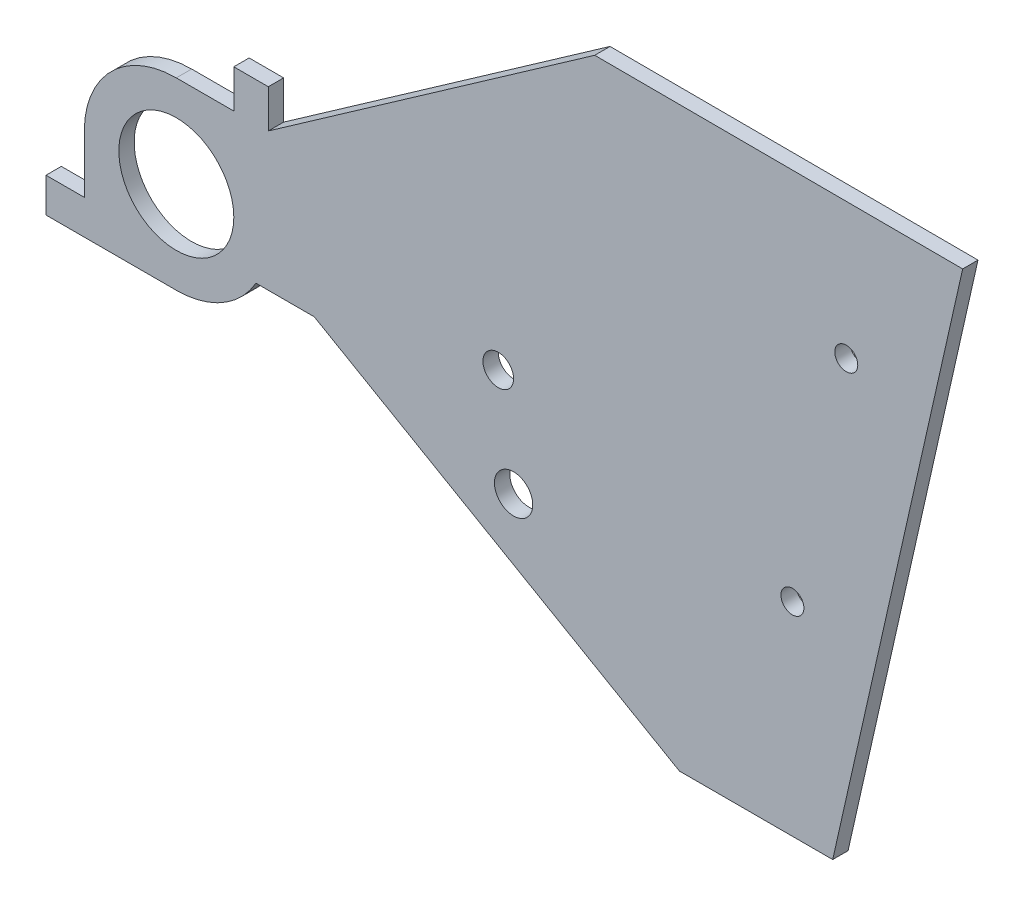
ISO-10303-21;
HEADER;
FILE_DESCRIPTION(('STEP AP214'),'2;1');
FILE_NAME('part.step','',(''),(''),'','','');
FILE_SCHEMA(('AUTOMOTIVE_DESIGN { 1 0 10303 214 1 1 1 1 }'));
ENDSEC;
DATA;
#1=APPLICATION_CONTEXT('core data for automotive mechanical design processes');
#2=APPLICATION_PROTOCOL_DEFINITION('international standard','automotive_design',2000,#1);
#3=PRODUCT_CONTEXT('',#1,'mechanical');
#4=PRODUCT('Part','Part','',(#3));
#5=PRODUCT_RELATED_PRODUCT_CATEGORY('part','',(#4));
#6=PRODUCT_DEFINITION_FORMATION('','',#4);
#7=PRODUCT_DEFINITION_CONTEXT('part definition',#1,'design');
#8=PRODUCT_DEFINITION('design','',#6,#7);
#9=PRODUCT_DEFINITION_SHAPE('','',#8);
#10=(LENGTH_UNIT() NAMED_UNIT(*) SI_UNIT(.MILLI.,.METRE.));
#11=(NAMED_UNIT(*) PLANE_ANGLE_UNIT() SI_UNIT($,.RADIAN.));
#12=(NAMED_UNIT(*) SI_UNIT($,.STERADIAN.) SOLID_ANGLE_UNIT());
#13=UNCERTAINTY_MEASURE_WITH_UNIT(LENGTH_MEASURE(1.E-05),#10,'distance_accuracy_value','');
#14=(GEOMETRIC_REPRESENTATION_CONTEXT(3) GLOBAL_UNCERTAINTY_ASSIGNED_CONTEXT((#13)) GLOBAL_UNIT_ASSIGNED_CONTEXT((#10,
#11,#12)) REPRESENTATION_CONTEXT('',''));
#15=CARTESIAN_POINT('',(0.,0.,0.));
#16=DIRECTION('',(0.,0.,1.));
#17=DIRECTION('',(1.,0.,0.));
#18=AXIS2_PLACEMENT_3D('',#15,#16,#17);
#19=CARTESIAN_POINT('',(15.,-15.,27.));
#20=DIRECTION('',(0.,0.,1.));
#21=DIRECTION('',(1.,0.,0.));
#22=AXIS2_PLACEMENT_3D('',#19,#20,#21);
#23=PLANE('',#22);
#24=CARTESIAN_POINT('',(59.,-28.,27.));
#25=DIRECTION('',(0.,0.,1.));
#26=DIRECTION('',(1.,0.,0.));
#27=AXIS2_PLACEMENT_3D('',#24,#25,#26);
#28=CIRCLE('',#27,2.49999999999999);
#29=CARTESIAN_POINT('',(61.5,-28.,27.));
#30=VERTEX_POINT('',#29);
#31=EDGE_CURVE('E349',#30,#30,#28,.T.);
#32=ORIENTED_EDGE('',*,*,#31,.F.);
#33=EDGE_LOOP('',(#32));
#34=FACE_BOUND('',#33,.T.);
#35=CARTESIAN_POINT('',(95.3735465566074,-21.9836605666019,27.));
#36=DIRECTION('',(0.,0.,1.));
#37=DIRECTION('',(1.,0.,0.));
#38=AXIS2_PLACEMENT_3D('',#35,#36,#37);
#39=CIRCLE('',#38,1.5);
#40=CARTESIAN_POINT('',(96.8735465566074,-21.9836605666019,27.));
#41=VERTEX_POINT('',#40);
#42=EDGE_CURVE('E361',#41,#41,#39,.T.);
#43=ORIENTED_EDGE('',*,*,#42,.F.);
#44=EDGE_LOOP('',(#43));
#45=FACE_BOUND('',#44,.T.);
#46=DIRECTION('',(-1.,0.,0.));
#47=VECTOR('',#46,1.);
#48=CARTESIAN_POINT('',(27.,2.,27.));
#49=LINE('',#48,#47);
#50=CARTESIAN_POINT('',(27.,2.,27.));
#51=VERTEX_POINT('',#50);
#52=CARTESIAN_POINT('',(22.5,2.,27.));
#53=VERTEX_POINT('',#52);
#54=EDGE_CURVE('E211',#51,#53,#49,.T.);
#55=ORIENTED_EDGE('',*,*,#54,.T.);
#56=DIRECTION('',(0.,-1.,0.));
#57=VECTOR('',#56,1.);
#58=CARTESIAN_POINT('',(22.5,2.,27.));
#59=LINE('',#58,#57);
#60=CARTESIAN_POINT('',(22.5,-3.,27.));
#61=VERTEX_POINT('',#60);
#62=EDGE_CURVE('E119',#53,#61,#59,.T.);
#63=ORIENTED_EDGE('',*,*,#62,.T.);
#64=DIRECTION('',(-1.,0.,0.));
#65=VECTOR('',#64,1.);
#66=CARTESIAN_POINT('',(22.5,-3.,27.));
#67=LINE('',#66,#65);
#68=CARTESIAN_POINT('',(15.,-3.,27.));
#69=VERTEX_POINT('',#68);
#70=EDGE_CURVE('E250',#61,#69,#67,.T.);
#71=ORIENTED_EDGE('',*,*,#70,.T.);
#72=CARTESIAN_POINT('',(15.,-15.,27.));
#73=DIRECTION('',(0.,0.,1.));
#74=DIRECTION('',(1.,0.,0.));
#75=AXIS2_PLACEMENT_3D('',#72,#73,#74);
#76=CIRCLE('',#75,12.);
#77=CARTESIAN_POINT('',(3.,-15.,27.));
#78=VERTEX_POINT('',#77);
#79=EDGE_CURVE('E269',#69,#78,#76,.T.);
#80=ORIENTED_EDGE('',*,*,#79,.T.);
#81=DIRECTION('',(0.,-1.,0.));
#82=VECTOR('',#81,1.);
#83=CARTESIAN_POINT('',(3.,-22.5,27.));
#84=LINE('',#83,#82);
#85=CARTESIAN_POINT('',(3.,-22.5,27.));
#86=VERTEX_POINT('',#85);
#87=EDGE_CURVE('E266',#78,#86,#84,.T.);
#88=ORIENTED_EDGE('',*,*,#87,.T.);
#89=DIRECTION('',(-1.,0.,0.));
#90=VECTOR('',#89,1.);
#91=CARTESIAN_POINT('',(-2.,-22.5,27.));
#92=LINE('',#91,#90);
#93=CARTESIAN_POINT('',(-2.,-22.5,27.));
#94=VERTEX_POINT('',#93);
#95=EDGE_CURVE('E268',#86,#94,#92,.T.);
#96=ORIENTED_EDGE('',*,*,#95,.T.);
#97=DIRECTION('',(0.,-1.,0.));
#98=VECTOR('',#97,1.);
#99=CARTESIAN_POINT('',(-1.99999999999999,-27.,27.));
#100=LINE('',#99,#98);
#101=CARTESIAN_POINT('',(-1.99999999999999,-27.,27.));
#102=VERTEX_POINT('',#101);
#103=EDGE_CURVE('E271',#94,#102,#100,.T.);
#104=ORIENTED_EDGE('',*,*,#103,.T.);
#105=DIRECTION('',(1.,0.,0.));
#106=VECTOR('',#105,1.);
#107=CARTESIAN_POINT('',(-1.99999999999999,-27.,27.));
#108=LINE('',#107,#106);
#109=CARTESIAN_POINT('',(15.,-27.,27.));
#110=VERTEX_POINT('',#109);
#111=EDGE_CURVE('E277',#102,#110,#108,.T.);
#112=ORIENTED_EDGE('',*,*,#111,.T.);
#113=CARTESIAN_POINT('',(15.,-15.,27.));
#114=DIRECTION('',(0.,0.,1.));
#115=DIRECTION('',(-1.,0.,0.));
#116=AXIS2_PLACEMENT_3D('',#113,#114,#115);
#117=CIRCLE('',#116,12.);
#118=CARTESIAN_POINT('',(25.3923048454133,-21.,27.));
#119=VERTEX_POINT('',#118);
#120=EDGE_CURVE('E279',#110,#119,#117,.T.);
#121=ORIENTED_EDGE('',*,*,#120,.T.);
#122=DIRECTION('',(1.,0.,0.));
#123=VECTOR('',#122,1.);
#124=CARTESIAN_POINT('',(25.3923048454133,-21.,27.));
#125=LINE('',#124,#123);
#126=CARTESIAN_POINT('',(33.,-21.,27.));
#127=VERTEX_POINT('',#126);
#128=EDGE_CURVE('E281',#119,#127,#125,.T.);
#129=ORIENTED_EDGE('',*,*,#128,.T.);
#130=DIRECTION('',(0.866025403784441,-0.499999999999996,0.));
#131=VECTOR('',#130,1.);
#132=CARTESIAN_POINT('',(33.,-21.,27.));
#133=LINE('',#132,#131);
#134=CARTESIAN_POINT('',(80.6313972081443,-48.4999999999998,27.));
#135=VERTEX_POINT('',#134);
#136=EDGE_CURVE('E283',#127,#135,#133,.T.);
#137=ORIENTED_EDGE('',*,*,#136,.T.);
#138=DIRECTION('',(1.,0.,0.));
#139=VECTOR('',#138,1.);
#140=CARTESIAN_POINT('',(80.6313972081443,-48.4999999999998,27.));
#141=LINE('',#140,#139);
#142=CARTESIAN_POINT('',(100.631397208144,-48.4999999999998,27.));
#143=VERTEX_POINT('',#142);
#144=EDGE_CURVE('E285',#135,#143,#141,.T.);
#145=ORIENTED_EDGE('',*,*,#144,.T.);
#146=DIRECTION('',(0.219896280158805,0.975523257525068,0.));
#147=VECTOR('',#146,1.);
#148=CARTESIAN_POINT('',(117.584077601536,26.7069748028441,27.));
#149=LINE('',#148,#147);
#150=CARTESIAN_POINT('',(117.584077601536,26.7069748028441,27.));
#151=VERTEX_POINT('',#150);
#152=EDGE_CURVE('E162',#143,#151,#149,.T.);
#153=ORIENTED_EDGE('',*,*,#152,.T.);
#154=DIRECTION('',(-0.999995992867543,0.00283094487004673,0.));
#155=VECTOR('',#154,1.);
#156=CARTESIAN_POINT('',(69.5840776015355,26.8428607011191,27.));
#157=LINE('',#156,#155);
#158=CARTESIAN_POINT('',(69.5840776015355,26.8428607011191,27.));
#159=VERTEX_POINT('',#158);
#160=EDGE_CURVE('E156',#151,#159,#157,.T.);
#161=ORIENTED_EDGE('',*,*,#160,.T.);
#162=DIRECTION('',(-0.818924569260298,-0.573901167329214,0.));
#163=VECTOR('',#162,1.);
#164=CARTESIAN_POINT('',(27.,-3.,27.));
#165=LINE('',#164,#163);
#166=CARTESIAN_POINT('',(27.,-3.,27.));
#167=VERTEX_POINT('',#166);
#168=EDGE_CURVE('E160',#159,#167,#165,.T.);
#169=ORIENTED_EDGE('',*,*,#168,.T.);
#170=DIRECTION('',(0.,1.,0.));
#171=VECTOR('',#170,1.);
#172=CARTESIAN_POINT('',(27.,-3.,27.));
#173=LINE('',#172,#171);
#174=EDGE_CURVE('E52',#167,#51,#173,.T.);
#175=ORIENTED_EDGE('',*,*,#174,.T.);
#176=EDGE_LOOP('',(#55,#63,#71,#80,#88,#96,#104,#112,#121,#129,#137,#145,#153,#161,#169,#175));
#177=FACE_BOUND('',#176,.T.);
#178=CARTESIAN_POINT('',(102.398666770346,8.99989290911363,27.));
#179=DIRECTION('',(0.,0.,1.));
#180=DIRECTION('',(1.,0.,0.));
#181=AXIS2_PLACEMENT_3D('',#178,#179,#180);
#182=CIRCLE('',#181,1.49999999999994);
#183=CARTESIAN_POINT('',(103.898666770346,8.99989290911363,27.));
#184=VERTEX_POINT('',#183);
#185=EDGE_CURVE('E184',#184,#184,#182,.T.);
#186=ORIENTED_EDGE('',*,*,#185,.F.);
#187=EDGE_LOOP('',(#186));
#188=FACE_BOUND('',#187,.T.);
#189=CARTESIAN_POINT('',(57.,-15.,27.));
#190=DIRECTION('',(0.,0.,1.));
#191=DIRECTION('',(1.,0.,0.));
#192=AXIS2_PLACEMENT_3D('',#189,#190,#191);
#193=CIRCLE('',#192,2.);
#194=CARTESIAN_POINT('',(59.,-15.,27.));
#195=VERTEX_POINT('',#194);
#196=EDGE_CURVE('E355',#195,#195,#193,.T.);
#197=ORIENTED_EDGE('',*,*,#196,.F.);
#198=EDGE_LOOP('',(#197));
#199=FACE_BOUND('',#198,.T.);
#200=CARTESIAN_POINT('',(15.,-15.,27.));
#201=DIRECTION('',(0.,0.,1.));
#202=DIRECTION('',(1.,0.,0.));
#203=AXIS2_PLACEMENT_3D('',#200,#201,#202);
#204=CIRCLE('',#203,7.5);
#205=CARTESIAN_POINT('',(22.5,-15.,27.));
#206=VERTEX_POINT('',#205);
#207=EDGE_CURVE('E340',#206,#206,#204,.T.);
#208=ORIENTED_EDGE('',*,*,#207,.F.);
#209=EDGE_LOOP('',(#208));
#210=FACE_BOUND('',#209,.T.);
#211=ADVANCED_FACE('F35',(#34,#45,#177,#188,#199,#210),#23,.T.);
#212=CARTESIAN_POINT('',(15.,-15.,25.));
#213=DIRECTION('',(0.,0.,1.));
#214=DIRECTION('',(1.,0.,0.));
#215=AXIS2_PLACEMENT_3D('',#212,#213,#214);
#216=PLANE('',#215);
#217=DIRECTION('',(-1.,0.,0.));
#218=VECTOR('',#217,1.);
#219=CARTESIAN_POINT('',(27.,2.,25.));
#220=LINE('',#219,#218);
#221=CARTESIAN_POINT('',(27.,2.,25.));
#222=VERTEX_POINT('',#221);
#223=CARTESIAN_POINT('',(22.5,2.,25.));
#224=VERTEX_POINT('',#223);
#225=EDGE_CURVE('E180',#222,#224,#220,.T.);
#226=ORIENTED_EDGE('',*,*,#225,.F.);
#227=DIRECTION('',(0.,1.,0.));
#228=VECTOR('',#227,1.);
#229=CARTESIAN_POINT('',(27.,-3.,25.));
#230=LINE('',#229,#228);
#231=CARTESIAN_POINT('',(27.,-3.,25.));
#232=VERTEX_POINT('',#231);
#233=EDGE_CURVE('E111',#232,#222,#230,.T.);
#234=ORIENTED_EDGE('',*,*,#233,.F.);
#235=DIRECTION('',(-0.818924569260298,-0.573901167329214,0.));
#236=VECTOR('',#235,1.);
#237=CARTESIAN_POINT('',(27.,-3.,25.));
#238=LINE('',#237,#236);
#239=CARTESIAN_POINT('',(69.5840776015355,26.8428607011191,25.));
#240=VERTEX_POINT('',#239);
#241=EDGE_CURVE('E105',#240,#232,#238,.T.);
#242=ORIENTED_EDGE('',*,*,#241,.F.);
#243=DIRECTION('',(-0.999995992867543,0.00283094487004673,0.));
#244=VECTOR('',#243,1.);
#245=CARTESIAN_POINT('',(69.5840776015355,26.8428607011191,25.));
#246=LINE('',#245,#244);
#247=CARTESIAN_POINT('',(117.584077601536,26.7069748028441,25.));
#248=VERTEX_POINT('',#247);
#249=EDGE_CURVE('E170',#248,#240,#246,.T.);
#250=ORIENTED_EDGE('',*,*,#249,.F.);
#251=DIRECTION('',(0.219896280158805,0.975523257525068,0.));
#252=VECTOR('',#251,1.);
#253=CARTESIAN_POINT('',(117.584077601536,26.7069748028441,25.));
#254=LINE('',#253,#252);
#255=CARTESIAN_POINT('',(100.631397208144,-48.4999999999998,25.));
#256=VERTEX_POINT('',#255);
#257=EDGE_CURVE('E206',#256,#248,#254,.T.);
#258=ORIENTED_EDGE('',*,*,#257,.F.);
#259=DIRECTION('',(1.,0.,0.));
#260=VECTOR('',#259,1.);
#261=CARTESIAN_POINT('',(80.6313972081443,-48.4999999999998,25.));
#262=LINE('',#261,#260);
#263=CARTESIAN_POINT('',(80.6313972081443,-48.4999999999998,25.));
#264=VERTEX_POINT('',#263);
#265=EDGE_CURVE('E204',#264,#256,#262,.T.);
#266=ORIENTED_EDGE('',*,*,#265,.F.);
#267=DIRECTION('',(0.866025403784441,-0.499999999999996,0.));
#268=VECTOR('',#267,1.);
#269=CARTESIAN_POINT('',(33.,-21.,25.));
#270=LINE('',#269,#268);
#271=CARTESIAN_POINT('',(33.,-21.,25.));
#272=VERTEX_POINT('',#271);
#273=EDGE_CURVE('E202',#272,#264,#270,.T.);
#274=ORIENTED_EDGE('',*,*,#273,.F.);
#275=DIRECTION('',(1.,0.,0.));
#276=VECTOR('',#275,1.);
#277=CARTESIAN_POINT('',(25.3923048454133,-21.,25.));
#278=LINE('',#277,#276);
#279=CARTESIAN_POINT('',(25.3923048454133,-21.,25.));
#280=VERTEX_POINT('',#279);
#281=EDGE_CURVE('E200',#280,#272,#278,.T.);
#282=ORIENTED_EDGE('',*,*,#281,.F.);
#283=CARTESIAN_POINT('',(15.,-15.,25.));
#284=DIRECTION('',(0.,0.,1.));
#285=DIRECTION('',(-1.,0.,0.));
#286=AXIS2_PLACEMENT_3D('',#283,#284,#285);
#287=CIRCLE('',#286,12.);
#288=CARTESIAN_POINT('',(15.,-27.,25.));
#289=VERTEX_POINT('',#288);
#290=EDGE_CURVE('E198',#289,#280,#287,.T.);
#291=ORIENTED_EDGE('',*,*,#290,.F.);
#292=DIRECTION('',(1.,0.,0.));
#293=VECTOR('',#292,1.);
#294=CARTESIAN_POINT('',(-1.99999999999999,-27.,25.));
#295=LINE('',#294,#293);
#296=CARTESIAN_POINT('',(-1.99999999999999,-27.,25.));
#297=VERTEX_POINT('',#296);
#298=EDGE_CURVE('E196',#297,#289,#295,.T.);
#299=ORIENTED_EDGE('',*,*,#298,.F.);
#300=DIRECTION('',(0.,-1.,0.));
#301=VECTOR('',#300,1.);
#302=CARTESIAN_POINT('',(-1.99999999999999,-27.,25.));
#303=LINE('',#302,#301);
#304=CARTESIAN_POINT('',(-2.,-22.5,25.));
#305=VERTEX_POINT('',#304);
#306=EDGE_CURVE('E194',#305,#297,#303,.T.);
#307=ORIENTED_EDGE('',*,*,#306,.F.);
#308=DIRECTION('',(-1.,0.,0.));
#309=VECTOR('',#308,1.);
#310=CARTESIAN_POINT('',(-2.,-22.5,25.));
#311=LINE('',#310,#309);
#312=CARTESIAN_POINT('',(3.,-22.5,25.));
#313=VERTEX_POINT('',#312);
#314=EDGE_CURVE('E192',#313,#305,#311,.T.);
#315=ORIENTED_EDGE('',*,*,#314,.F.);
#316=DIRECTION('',(0.,-1.,0.));
#317=VECTOR('',#316,1.);
#318=CARTESIAN_POINT('',(3.,-22.5,25.));
#319=LINE('',#318,#317);
#320=CARTESIAN_POINT('',(3.,-15.,25.));
#321=VERTEX_POINT('',#320);
#322=EDGE_CURVE('E190',#321,#313,#319,.T.);
#323=ORIENTED_EDGE('',*,*,#322,.F.);
#324=CARTESIAN_POINT('',(15.,-15.,25.));
#325=DIRECTION('',(0.,0.,1.));
#326=DIRECTION('',(1.,0.,0.));
#327=AXIS2_PLACEMENT_3D('',#324,#325,#326);
#328=CIRCLE('',#327,12.);
#329=CARTESIAN_POINT('',(15.,-3.,25.));
#330=VERTEX_POINT('',#329);
#331=EDGE_CURVE('E188',#330,#321,#328,.T.);
#332=ORIENTED_EDGE('',*,*,#331,.F.);
#333=DIRECTION('',(-1.,0.,0.));
#334=VECTOR('',#333,1.);
#335=CARTESIAN_POINT('',(22.5,-3.,25.));
#336=LINE('',#335,#334);
#337=CARTESIAN_POINT('',(22.5,-3.,25.));
#338=VERTEX_POINT('',#337);
#339=EDGE_CURVE('E186',#338,#330,#336,.T.);
#340=ORIENTED_EDGE('',*,*,#339,.F.);
#341=DIRECTION('',(0.,-1.,0.));
#342=VECTOR('',#341,1.);
#343=CARTESIAN_POINT('',(22.5,2.,25.));
#344=LINE('',#343,#342);
#345=EDGE_CURVE('E183',#224,#338,#344,.T.);
#346=ORIENTED_EDGE('',*,*,#345,.F.);
#347=EDGE_LOOP('',(#226,#234,#242,#250,#258,#266,#274,#282,#291,#299,#307,#315,#323,#332,#340,#346));
#348=FACE_BOUND('',#347,.T.);
#349=CARTESIAN_POINT('',(102.398666770346,8.99989290911363,25.));
#350=DIRECTION('',(0.,0.,1.));
#351=DIRECTION('',(1.,0.,0.));
#352=AXIS2_PLACEMENT_3D('',#349,#350,#351);
#353=CIRCLE('',#352,1.49999999999994);
#354=CARTESIAN_POINT('',(103.898666770346,8.99989290911363,25.));
#355=VERTEX_POINT('',#354);
#356=EDGE_CURVE('E364',#355,#355,#353,.T.);
#357=ORIENTED_EDGE('',*,*,#356,.T.);
#358=EDGE_LOOP('',(#357));
#359=FACE_BOUND('',#358,.T.);
#360=CARTESIAN_POINT('',(95.3735465566074,-21.9836605666019,25.));
#361=DIRECTION('',(0.,0.,1.));
#362=DIRECTION('',(1.,0.,0.));
#363=AXIS2_PLACEMENT_3D('',#360,#361,#362);
#364=CIRCLE('',#363,1.5);
#365=CARTESIAN_POINT('',(96.8735465566074,-21.9836605666019,25.));
#366=VERTEX_POINT('',#365);
#367=EDGE_CURVE('E358',#366,#366,#364,.T.);
#368=ORIENTED_EDGE('',*,*,#367,.T.);
#369=EDGE_LOOP('',(#368));
#370=FACE_BOUND('',#369,.T.);
#371=CARTESIAN_POINT('',(57.,-15.,25.));
#372=DIRECTION('',(0.,0.,1.));
#373=DIRECTION('',(1.,0.,0.));
#374=AXIS2_PLACEMENT_3D('',#371,#372,#373);
#375=CIRCLE('',#374,2.);
#376=CARTESIAN_POINT('',(59.,-15.,25.));
#377=VERTEX_POINT('',#376);
#378=EDGE_CURVE('E352',#377,#377,#375,.T.);
#379=ORIENTED_EDGE('',*,*,#378,.T.);
#380=EDGE_LOOP('',(#379));
#381=FACE_BOUND('',#380,.T.);
#382=CARTESIAN_POINT('',(59.,-28.,25.));
#383=DIRECTION('',(0.,0.,1.));
#384=DIRECTION('',(1.,0.,0.));
#385=AXIS2_PLACEMENT_3D('',#382,#383,#384);
#386=CIRCLE('',#385,2.49999999999999);
#387=CARTESIAN_POINT('',(61.5,-28.,25.));
#388=VERTEX_POINT('',#387);
#389=EDGE_CURVE('E346',#388,#388,#386,.T.);
#390=ORIENTED_EDGE('',*,*,#389,.T.);
#391=EDGE_LOOP('',(#390));
#392=FACE_BOUND('',#391,.T.);
#393=CARTESIAN_POINT('',(15.,-15.,25.));
#394=DIRECTION('',(0.,0.,1.));
#395=DIRECTION('',(1.,0.,0.));
#396=AXIS2_PLACEMENT_3D('',#393,#394,#395);
#397=CIRCLE('',#396,7.5);
#398=CARTESIAN_POINT('',(22.5,-15.,25.));
#399=VERTEX_POINT('',#398);
#400=EDGE_CURVE('E343',#399,#399,#397,.T.);
#401=ORIENTED_EDGE('',*,*,#400,.T.);
#402=EDGE_LOOP('',(#401));
#403=FACE_BOUND('',#402,.T.);
#404=ADVANCED_FACE('F254',(#348,#359,#370,#381,#392,#403),#216,.F.);
#405=CARTESIAN_POINT('',(27.,2.,27.));
#406=DIRECTION('',(0.,-1.,0.));
#407=DIRECTION('',(1.,0.,0.));
#408=AXIS2_PLACEMENT_3D('',#405,#406,#407);
#409=PLANE('',#408);
#410=ORIENTED_EDGE('',*,*,#225,.T.);
#411=DIRECTION('',(0.,0.,-1.));
#412=VECTOR('',#411,1.);
#413=CARTESIAN_POINT('',(22.5,2.,27.));
#414=LINE('',#413,#412);
#415=EDGE_CURVE('E11',#53,#224,#414,.T.);
#416=ORIENTED_EDGE('',*,*,#415,.F.);
#417=ORIENTED_EDGE('',*,*,#54,.F.);
#418=DIRECTION('',(0.,0.,-1.));
#419=VECTOR('',#418,1.);
#420=CARTESIAN_POINT('',(27.,2.,27.));
#421=LINE('',#420,#419);
#422=EDGE_CURVE('E176',#51,#222,#421,.T.);
#423=ORIENTED_EDGE('',*,*,#422,.T.);
#424=EDGE_LOOP('',(#410,#416,#417,#423));
#425=FACE_BOUND('',#424,.T.);
#426=ADVANCED_FACE('F37',(#425),#409,.F.);
#427=CARTESIAN_POINT('',(22.5,2.,27.));
#428=DIRECTION('',(1.,0.,0.));
#429=DIRECTION('',(0.,1.,0.));
#430=AXIS2_PLACEMENT_3D('',#427,#428,#429);
#431=PLANE('',#430);
#432=ORIENTED_EDGE('',*,*,#345,.T.);
#433=DIRECTION('',(0.,0.,-1.));
#434=VECTOR('',#433,1.);
#435=CARTESIAN_POINT('',(22.5,-3.,27.));
#436=LINE('',#435,#434);
#437=EDGE_CURVE('E44',#61,#338,#436,.T.);
#438=ORIENTED_EDGE('',*,*,#437,.F.);
#439=ORIENTED_EDGE('',*,*,#62,.F.);
#440=ORIENTED_EDGE('',*,*,#415,.T.);
#441=EDGE_LOOP('',(#432,#438,#439,#440));
#442=FACE_BOUND('',#441,.T.);
#443=ADVANCED_FACE('F523',(#442),#431,.F.);
#444=CARTESIAN_POINT('',(22.5,-3.,27.));
#445=DIRECTION('',(0.,-1.,0.));
#446=DIRECTION('',(1.,0.,0.));
#447=AXIS2_PLACEMENT_3D('',#444,#445,#446);
#448=PLANE('',#447);
#449=ORIENTED_EDGE('',*,*,#339,.T.);
#450=DIRECTION('',(0.,0.,-1.));
#451=VECTOR('',#450,1.);
#452=CARTESIAN_POINT('',(15.,-3.,27.));
#453=LINE('',#452,#451);
#454=EDGE_CURVE('E242',#69,#330,#453,.T.);
#455=ORIENTED_EDGE('',*,*,#454,.F.);
#456=ORIENTED_EDGE('',*,*,#70,.F.);
#457=ORIENTED_EDGE('',*,*,#437,.T.);
#458=EDGE_LOOP('',(#449,#455,#456,#457));
#459=FACE_BOUND('',#458,.T.);
#460=ADVANCED_FACE('F248',(#459),#448,.F.);
#461=CARTESIAN_POINT('',(15.,-15.,27.));
#462=DIRECTION('',(0.,0.,-1.));
#463=DIRECTION('',(-1.,0.,0.));
#464=AXIS2_PLACEMENT_3D('',#461,#462,#463);
#465=CYLINDRICAL_SURFACE('',#464,12.);
#466=ORIENTED_EDGE('',*,*,#331,.T.);
#467=DIRECTION('',(0.,0.,-1.));
#468=VECTOR('',#467,1.);
#469=CARTESIAN_POINT('',(3.,-15.,27.));
#470=LINE('',#469,#468);
#471=EDGE_CURVE('E239',#78,#321,#470,.T.);
#472=ORIENTED_EDGE('',*,*,#471,.F.);
#473=ORIENTED_EDGE('',*,*,#79,.F.);
#474=ORIENTED_EDGE('',*,*,#454,.T.);
#475=EDGE_LOOP('',(#466,#472,#473,#474));
#476=FACE_BOUND('',#475,.T.);
#477=ADVANCED_FACE('F260',(#476),#465,.T.);
#478=CARTESIAN_POINT('',(3.,-22.5,27.));
#479=DIRECTION('',(1.,0.,0.));
#480=DIRECTION('',(0.,1.,0.));
#481=AXIS2_PLACEMENT_3D('',#478,#479,#480);
#482=PLANE('',#481);
#483=ORIENTED_EDGE('',*,*,#322,.T.);
#484=DIRECTION('',(0.,0.,-1.));
#485=VECTOR('',#484,1.);
#486=CARTESIAN_POINT('',(3.,-22.5,27.));
#487=LINE('',#486,#485);
#488=EDGE_CURVE('E236',#86,#313,#487,.T.);
#489=ORIENTED_EDGE('',*,*,#488,.F.);
#490=ORIENTED_EDGE('',*,*,#87,.F.);
#491=ORIENTED_EDGE('',*,*,#471,.T.);
#492=EDGE_LOOP('',(#483,#489,#490,#491));
#493=FACE_BOUND('',#492,.T.);
#494=ADVANCED_FACE('F264',(#493),#482,.F.);
#495=CARTESIAN_POINT('',(-2.,-22.5,27.));
#496=DIRECTION('',(0.,-1.,0.));
#497=DIRECTION('',(0.,0.,-1.));
#498=AXIS2_PLACEMENT_3D('',#495,#496,#497);
#499=PLANE('',#498);
#500=ORIENTED_EDGE('',*,*,#314,.T.);
#501=DIRECTION('',(0.,0.,-1.));
#502=VECTOR('',#501,1.);
#503=CARTESIAN_POINT('',(-2.,-22.5,27.));
#504=LINE('',#503,#502);
#505=EDGE_CURVE('E233',#94,#305,#504,.T.);
#506=ORIENTED_EDGE('',*,*,#505,.F.);
#507=ORIENTED_EDGE('',*,*,#95,.F.);
#508=ORIENTED_EDGE('',*,*,#488,.T.);
#509=EDGE_LOOP('',(#500,#506,#507,#508));
#510=FACE_BOUND('',#509,.T.);
#511=ADVANCED_FACE('F488',(#510),#499,.F.);
#512=CARTESIAN_POINT('',(-1.99999999999999,-27.,27.));
#513=DIRECTION('',(1.,0.,0.));
#514=DIRECTION('',(0.,1.,0.));
#515=AXIS2_PLACEMENT_3D('',#512,#513,#514);
#516=PLANE('',#515);
#517=ORIENTED_EDGE('',*,*,#306,.T.);
#518=DIRECTION('',(0.,0.,-1.));
#519=VECTOR('',#518,1.);
#520=CARTESIAN_POINT('',(-1.99999999999999,-27.,27.));
#521=LINE('',#520,#519);
#522=EDGE_CURVE('E230',#102,#297,#521,.T.);
#523=ORIENTED_EDGE('',*,*,#522,.F.);
#524=ORIENTED_EDGE('',*,*,#103,.F.);
#525=ORIENTED_EDGE('',*,*,#505,.T.);
#526=EDGE_LOOP('',(#517,#523,#524,#525));
#527=FACE_BOUND('',#526,.T.);
#528=ADVANCED_FACE('F478',(#527),#516,.F.);
#529=CARTESIAN_POINT('',(-1.99999999999999,-27.,27.));
#530=DIRECTION('',(0.,1.,0.));
#531=DIRECTION('',(-1.,0.,0.));
#532=AXIS2_PLACEMENT_3D('',#529,#530,#531);
#533=PLANE('',#532);
#534=ORIENTED_EDGE('',*,*,#298,.T.);
#535=DIRECTION('',(0.,0.,-1.));
#536=VECTOR('',#535,1.);
#537=CARTESIAN_POINT('',(15.,-27.,27.));
#538=LINE('',#537,#536);
#539=EDGE_CURVE('E227',#110,#289,#538,.T.);
#540=ORIENTED_EDGE('',*,*,#539,.F.);
#541=ORIENTED_EDGE('',*,*,#111,.F.);
#542=ORIENTED_EDGE('',*,*,#522,.T.);
#543=EDGE_LOOP('',(#534,#540,#541,#542));
#544=FACE_BOUND('',#543,.T.);
#545=ADVANCED_FACE('F468',(#544),#533,.F.);
#546=CARTESIAN_POINT('',(15.,-15.,27.));
#547=DIRECTION('',(0.,0.,-1.));
#548=DIRECTION('',(-1.,0.,0.));
#549=AXIS2_PLACEMENT_3D('',#546,#547,#548);
#550=CYLINDRICAL_SURFACE('',#549,12.);
#551=ORIENTED_EDGE('',*,*,#290,.T.);
#552=DIRECTION('',(0.,0.,-1.));
#553=VECTOR('',#552,1.);
#554=CARTESIAN_POINT('',(25.3923048454133,-21.,27.));
#555=LINE('',#554,#553);
#556=EDGE_CURVE('E224',#119,#280,#555,.T.);
#557=ORIENTED_EDGE('',*,*,#556,.F.);
#558=ORIENTED_EDGE('',*,*,#120,.F.);
#559=ORIENTED_EDGE('',*,*,#539,.T.);
#560=EDGE_LOOP('',(#551,#557,#558,#559));
#561=FACE_BOUND('',#560,.T.);
#562=ADVANCED_FACE('F458',(#561),#550,.T.);
#563=CARTESIAN_POINT('',(25.3923048454133,-21.,27.));
#564=DIRECTION('',(0.,1.,0.));
#565=DIRECTION('',(0.,0.,1.));
#566=AXIS2_PLACEMENT_3D('',#563,#564,#565);
#567=PLANE('',#566);
#568=ORIENTED_EDGE('',*,*,#281,.T.);
#569=DIRECTION('',(0.,0.,-1.));
#570=VECTOR('',#569,1.);
#571=CARTESIAN_POINT('',(33.,-21.,27.));
#572=LINE('',#571,#570);
#573=EDGE_CURVE('E221',#127,#272,#572,.T.);
#574=ORIENTED_EDGE('',*,*,#573,.F.);
#575=ORIENTED_EDGE('',*,*,#128,.F.);
#576=ORIENTED_EDGE('',*,*,#556,.T.);
#577=EDGE_LOOP('',(#568,#574,#575,#576));
#578=FACE_BOUND('',#577,.T.);
#579=ADVANCED_FACE('F448',(#578),#567,.F.);
#580=CARTESIAN_POINT('',(33.,-21.,27.));
#581=DIRECTION('',(0.499999999999995,0.866025403784441,0.));
#582=DIRECTION('',(-0.866025403784441,0.499999999999995,0.));
#583=AXIS2_PLACEMENT_3D('',#580,#581,#582);
#584=PLANE('',#583);
#585=ORIENTED_EDGE('',*,*,#273,.T.);
#586=DIRECTION('',(0.,0.,-1.));
#587=VECTOR('',#586,1.);
#588=CARTESIAN_POINT('',(80.6313972081443,-48.4999999999998,27.));
#589=LINE('',#588,#587);
#590=EDGE_CURVE('E218',#135,#264,#589,.T.);
#591=ORIENTED_EDGE('',*,*,#590,.F.);
#592=ORIENTED_EDGE('',*,*,#136,.F.);
#593=ORIENTED_EDGE('',*,*,#573,.T.);
#594=EDGE_LOOP('',(#585,#591,#592,#593));
#595=FACE_BOUND('',#594,.T.);
#596=ADVANCED_FACE('F439',(#595),#584,.F.);
#597=CARTESIAN_POINT('',(80.6313972081443,-48.4999999999998,27.));
#598=DIRECTION('',(0.,1.,0.));
#599=DIRECTION('',(-1.,0.,0.));
#600=AXIS2_PLACEMENT_3D('',#597,#598,#599);
#601=PLANE('',#600);
#602=ORIENTED_EDGE('',*,*,#265,.T.);
#603=DIRECTION('',(0.,0.,-1.));
#604=VECTOR('',#603,1.);
#605=CARTESIAN_POINT('',(100.631397208144,-48.4999999999998,27.));
#606=LINE('',#605,#604);
#607=EDGE_CURVE('E215',#143,#256,#606,.T.);
#608=ORIENTED_EDGE('',*,*,#607,.F.);
#609=ORIENTED_EDGE('',*,*,#144,.F.);
#610=ORIENTED_EDGE('',*,*,#590,.T.);
#611=EDGE_LOOP('',(#602,#608,#609,#610));
#612=FACE_BOUND('',#611,.T.);
#613=ADVANCED_FACE('F291',(#612),#601,.F.);
#614=CARTESIAN_POINT('',(117.584077601536,26.7069748028441,27.));
#615=DIRECTION('',(-0.975523257525068,0.219896280158805,0.));
#616=DIRECTION('',(-0.219896280158805,-0.975523257525068,0.));
#617=AXIS2_PLACEMENT_3D('',#614,#615,#616);
#618=PLANE('',#617);
#619=ORIENTED_EDGE('',*,*,#257,.T.);
#620=DIRECTION('',(0.,0.,-1.));
#621=VECTOR('',#620,1.);
#622=CARTESIAN_POINT('',(117.584077601536,26.7069748028441,27.));
#623=LINE('',#622,#621);
#624=EDGE_CURVE('E171',#151,#248,#623,.T.);
#625=ORIENTED_EDGE('',*,*,#624,.F.);
#626=ORIENTED_EDGE('',*,*,#152,.F.);
#627=ORIENTED_EDGE('',*,*,#607,.T.);
#628=EDGE_LOOP('',(#619,#625,#626,#627));
#629=FACE_BOUND('',#628,.T.);
#630=ADVANCED_FACE('F295',(#629),#618,.F.);
#631=CARTESIAN_POINT('',(69.5840776015355,26.8428607011191,27.));
#632=DIRECTION('',(-0.00283094487004673,-0.999995992867543,0.));
#633=DIRECTION('',(0.999995992867543,-0.00283094487004673,0.));
#634=AXIS2_PLACEMENT_3D('',#631,#632,#633);
#635=PLANE('',#634);
#636=ORIENTED_EDGE('',*,*,#249,.T.);
#637=DIRECTION('',(0.,0.,-1.));
#638=VECTOR('',#637,1.);
#639=CARTESIAN_POINT('',(69.5840776015355,26.8428607011191,27.));
#640=LINE('',#639,#638);
#641=EDGE_CURVE('E167',#159,#240,#640,.T.);
#642=ORIENTED_EDGE('',*,*,#641,.F.);
#643=ORIENTED_EDGE('',*,*,#160,.F.);
#644=ORIENTED_EDGE('',*,*,#624,.T.);
#645=EDGE_LOOP('',(#636,#642,#643,#644));
#646=FACE_BOUND('',#645,.T.);
#647=ADVANCED_FACE('F168',(#646),#635,.F.);
#648=CARTESIAN_POINT('',(27.,-3.,27.));
#649=DIRECTION('',(0.573901167329214,-0.818924569260298,0.));
#650=DIRECTION('',(0.818924569260298,0.573901167329214,0.));
#651=AXIS2_PLACEMENT_3D('',#648,#649,#650);
#652=PLANE('',#651);
#653=ORIENTED_EDGE('',*,*,#241,.T.);
#654=DIRECTION('',(0.,0.,-1.));
#655=VECTOR('',#654,1.);
#656=CARTESIAN_POINT('',(27.,-3.,27.));
#657=LINE('',#656,#655);
#658=EDGE_CURVE('E172',#167,#232,#657,.T.);
#659=ORIENTED_EDGE('',*,*,#658,.F.);
#660=ORIENTED_EDGE('',*,*,#168,.F.);
#661=ORIENTED_EDGE('',*,*,#641,.T.);
#662=EDGE_LOOP('',(#653,#659,#660,#661));
#663=FACE_BOUND('',#662,.T.);
#664=ADVANCED_FACE('F174',(#663),#652,.F.);
#665=CARTESIAN_POINT('',(27.,-3.,27.));
#666=DIRECTION('',(-1.,0.,0.));
#667=DIRECTION('',(0.,-1.,0.));
#668=AXIS2_PLACEMENT_3D('',#665,#666,#667);
#669=PLANE('',#668);
#670=ORIENTED_EDGE('',*,*,#233,.T.);
#671=ORIENTED_EDGE('',*,*,#422,.F.);
#672=ORIENTED_EDGE('',*,*,#174,.F.);
#673=ORIENTED_EDGE('',*,*,#658,.T.);
#674=EDGE_LOOP('',(#670,#671,#672,#673));
#675=FACE_BOUND('',#674,.T.);
#676=ADVANCED_FACE('F299',(#675),#669,.F.);
#677=CARTESIAN_POINT('',(102.398666770346,8.99989290911363,27.));
#678=DIRECTION('',(0.,0.,-1.));
#679=DIRECTION('',(-1.,0.,0.));
#680=AXIS2_PLACEMENT_3D('',#677,#678,#679);
#681=CYLINDRICAL_SURFACE('',#680,1.49999999999994);
#682=ORIENTED_EDGE('',*,*,#185,.T.);
#683=EDGE_LOOP('',(#682));
#684=FACE_BOUND('',#683,.T.);
#685=ORIENTED_EDGE('',*,*,#356,.F.);
#686=EDGE_LOOP('',(#685));
#687=FACE_BOUND('',#686,.T.);
#688=ADVANCED_FACE('F301',(#684,#687),#681,.F.);
#689=CARTESIAN_POINT('',(95.3735465566074,-21.9836605666019,27.));
#690=DIRECTION('',(0.,0.,-1.));
#691=DIRECTION('',(-1.,0.,0.));
#692=AXIS2_PLACEMENT_3D('',#689,#690,#691);
#693=CYLINDRICAL_SURFACE('',#692,1.5);
#694=ORIENTED_EDGE('',*,*,#42,.T.);
#695=EDGE_LOOP('',(#694));
#696=FACE_BOUND('',#695,.T.);
#697=ORIENTED_EDGE('',*,*,#367,.F.);
#698=EDGE_LOOP('',(#697));
#699=FACE_BOUND('',#698,.T.);
#700=ADVANCED_FACE('F307',(#696,#699),#693,.F.);
#701=CARTESIAN_POINT('',(57.,-15.,27.));
#702=DIRECTION('',(0.,0.,-1.));
#703=DIRECTION('',(-1.,0.,0.));
#704=AXIS2_PLACEMENT_3D('',#701,#702,#703);
#705=CYLINDRICAL_SURFACE('',#704,2.);
#706=ORIENTED_EDGE('',*,*,#196,.T.);
#707=EDGE_LOOP('',(#706));
#708=FACE_BOUND('',#707,.T.);
#709=ORIENTED_EDGE('',*,*,#378,.F.);
#710=EDGE_LOOP('',(#709));
#711=FACE_BOUND('',#710,.T.);
#712=ADVANCED_FACE('F323',(#708,#711),#705,.F.);
#713=CARTESIAN_POINT('',(59.,-28.,27.));
#714=DIRECTION('',(0.,0.,-1.));
#715=DIRECTION('',(-1.,0.,0.));
#716=AXIS2_PLACEMENT_3D('',#713,#714,#715);
#717=CYLINDRICAL_SURFACE('',#716,2.49999999999999);
#718=ORIENTED_EDGE('',*,*,#31,.T.);
#719=EDGE_LOOP('',(#718));
#720=FACE_BOUND('',#719,.T.);
#721=ORIENTED_EDGE('',*,*,#389,.F.);
#722=EDGE_LOOP('',(#721));
#723=FACE_BOUND('',#722,.T.);
#724=ADVANCED_FACE('F327',(#720,#723),#717,.F.);
#725=CARTESIAN_POINT('',(15.,-15.,27.));
#726=DIRECTION('',(0.,0.,-1.));
#727=DIRECTION('',(-1.,0.,0.));
#728=AXIS2_PLACEMENT_3D('',#725,#726,#727);
#729=CYLINDRICAL_SURFACE('',#728,7.5);
#730=ORIENTED_EDGE('',*,*,#207,.T.);
#731=EDGE_LOOP('',(#730));
#732=FACE_BOUND('',#731,.T.);
#733=ORIENTED_EDGE('',*,*,#400,.F.);
#734=EDGE_LOOP('',(#733));
#735=FACE_BOUND('',#734,.T.);
#736=ADVANCED_FACE('F331',(#732,#735),#729,.F.);
#737=CLOSED_SHELL('',(#211,#404,#426,#443,#460,#477,#494,#511,#528,#545,#562,#579,#596,#613,
#630,#647,#664,#676,#688,#700,#712,#724,#736));
#738=MANIFOLD_SOLID_BREP('B2',#737);
#739=ADVANCED_BREP_SHAPE_REPRESENTATION('',(#18,#738),#14);
#740=SHAPE_DEFINITION_REPRESENTATION(#9,#739);
ENDSEC;
END-ISO-10303-21;
